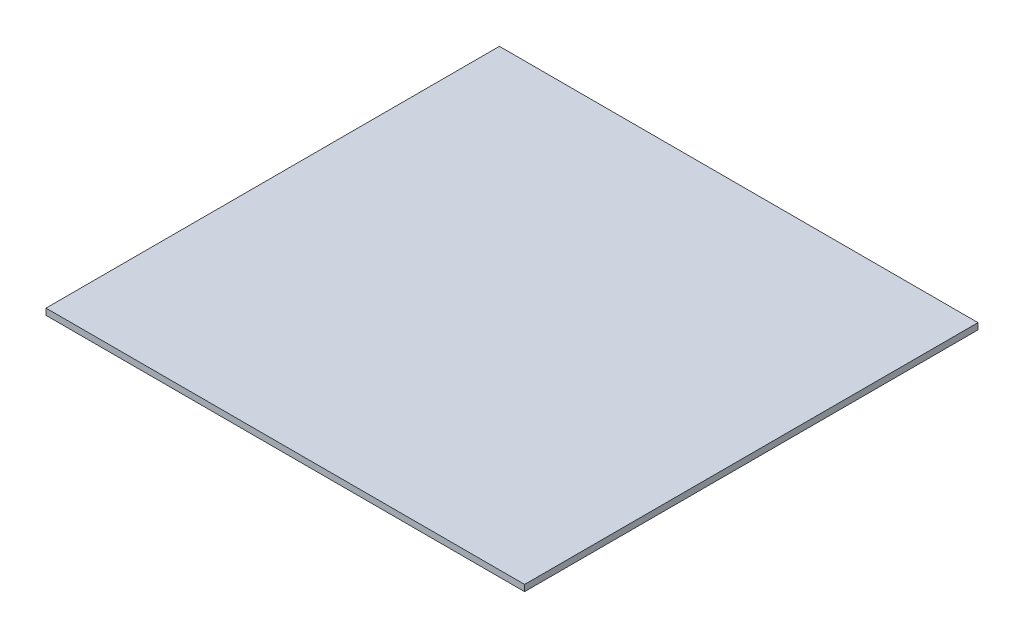
ISO-10303-21;
HEADER;
FILE_DESCRIPTION(('STEP AP214'),'2;1');
FILE_NAME('part.step','',(''),(''),'','','');
FILE_SCHEMA(('AUTOMOTIVE_DESIGN { 1 0 10303 214 1 1 1 1 }'));
ENDSEC;
DATA;
#1=APPLICATION_CONTEXT('core data for automotive mechanical design processes');
#2=APPLICATION_PROTOCOL_DEFINITION('international standard','automotive_design',2000,#1);
#3=PRODUCT_CONTEXT('',#1,'mechanical');
#4=PRODUCT('Part','Part','',(#3));
#5=PRODUCT_RELATED_PRODUCT_CATEGORY('part','',(#4));
#6=PRODUCT_DEFINITION_FORMATION('','',#4);
#7=PRODUCT_DEFINITION_CONTEXT('part definition',#1,'design');
#8=PRODUCT_DEFINITION('design','',#6,#7);
#9=PRODUCT_DEFINITION_SHAPE('','',#8);
#10=(LENGTH_UNIT() NAMED_UNIT(*) SI_UNIT(.MILLI.,.METRE.));
#11=(NAMED_UNIT(*) PLANE_ANGLE_UNIT() SI_UNIT($,.RADIAN.));
#12=(NAMED_UNIT(*) SI_UNIT($,.STERADIAN.) SOLID_ANGLE_UNIT());
#13=UNCERTAINTY_MEASURE_WITH_UNIT(LENGTH_MEASURE(1.E-05),#10,'distance_accuracy_value','');
#14=(GEOMETRIC_REPRESENTATION_CONTEXT(3) GLOBAL_UNCERTAINTY_ASSIGNED_CONTEXT((#13)) GLOBAL_UNIT_ASSIGNED_CONTEXT((#10,
#11,#12)) REPRESENTATION_CONTEXT('',''));
#15=CARTESIAN_POINT('',(0.,0.,0.));
#16=DIRECTION('',(0.,0.,1.));
#17=DIRECTION('',(1.,0.,0.));
#18=AXIS2_PLACEMENT_3D('',#15,#16,#17);
#19=CARTESIAN_POINT('',(0.,12.7,0.));
#20=DIRECTION('',(1.,0.,0.));
#21=DIRECTION('',(0.,0.,-1.));
#22=AXIS2_PLACEMENT_3D('',#19,#20,#21);
#23=PLANE('',#22);
#24=DIRECTION('',(0.,0.,1.));
#25=VECTOR('',#24,1.);
#26=CARTESIAN_POINT('',(0.,0.,0.));
#27=LINE('',#26,#25);
#28=CARTESIAN_POINT('',(0.,0.,-914.4));
#29=VERTEX_POINT('',#28);
#30=CARTESIAN_POINT('',(0.,0.,0.));
#31=VERTEX_POINT('',#30);
#32=EDGE_CURVE('E99',#29,#31,#27,.T.);
#33=ORIENTED_EDGE('',*,*,#32,.T.);
#34=DIRECTION('',(0.,-1.,0.));
#35=VECTOR('',#34,1.);
#36=CARTESIAN_POINT('',(0.,12.7,0.));
#37=LINE('',#36,#35);
#38=CARTESIAN_POINT('',(0.,12.7,0.));
#39=VERTEX_POINT('',#38);
#40=EDGE_CURVE('E11',#39,#31,#37,.T.);
#41=ORIENTED_EDGE('',*,*,#40,.F.);
#42=DIRECTION('',(0.,0.,1.));
#43=VECTOR('',#42,1.);
#44=CARTESIAN_POINT('',(0.,12.7,0.));
#45=LINE('',#44,#43);
#46=CARTESIAN_POINT('',(0.,12.7,-914.4));
#47=VERTEX_POINT('',#46);
#48=EDGE_CURVE('E87',#47,#39,#45,.T.);
#49=ORIENTED_EDGE('',*,*,#48,.F.);
#50=DIRECTION('',(0.,-1.,0.));
#51=VECTOR('',#50,1.);
#52=CARTESIAN_POINT('',(0.,12.7,-914.4));
#53=LINE('',#52,#51);
#54=EDGE_CURVE('E95',#47,#29,#53,.T.);
#55=ORIENTED_EDGE('',*,*,#54,.T.);
#56=EDGE_LOOP('',(#33,#41,#49,#55));
#57=FACE_BOUND('',#56,.T.);
#58=ADVANCED_FACE('F36',(#57),#23,.F.);
#59=CARTESIAN_POINT('',(0.,12.7,0.));
#60=DIRECTION('',(0.,0.,-1.));
#61=DIRECTION('',(-1.,0.,0.));
#62=AXIS2_PLACEMENT_3D('',#59,#60,#61);
#63=PLANE('',#62);
#64=DIRECTION('',(1.,0.,0.));
#65=VECTOR('',#64,1.);
#66=CARTESIAN_POINT('',(0.,0.,0.));
#67=LINE('',#66,#65);
#68=CARTESIAN_POINT('',(965.2,0.,0.));
#69=VERTEX_POINT('',#68);
#70=EDGE_CURVE('E91',#31,#69,#67,.T.);
#71=ORIENTED_EDGE('',*,*,#70,.T.);
#72=DIRECTION('',(0.,-1.,0.));
#73=VECTOR('',#72,1.);
#74=CARTESIAN_POINT('',(965.2,12.7,0.));
#75=LINE('',#74,#73);
#76=CARTESIAN_POINT('',(965.2,12.7,0.));
#77=VERTEX_POINT('',#76);
#78=EDGE_CURVE('E44',#77,#69,#75,.T.);
#79=ORIENTED_EDGE('',*,*,#78,.F.);
#80=DIRECTION('',(1.,0.,0.));
#81=VECTOR('',#80,1.);
#82=CARTESIAN_POINT('',(0.,12.7,0.));
#83=LINE('',#82,#81);
#84=EDGE_CURVE('E82',#39,#77,#83,.T.);
#85=ORIENTED_EDGE('',*,*,#84,.F.);
#86=ORIENTED_EDGE('',*,*,#40,.T.);
#87=EDGE_LOOP('',(#71,#79,#85,#86));
#88=FACE_BOUND('',#87,.T.);
#89=ADVANCED_FACE('F90',(#88),#63,.F.);
#90=CARTESIAN_POINT('',(965.2,12.7,0.));
#91=DIRECTION('',(-1.,0.,0.));
#92=DIRECTION('',(0.,0.,1.));
#93=AXIS2_PLACEMENT_3D('',#90,#91,#92);
#94=PLANE('',#93);
#95=DIRECTION('',(0.,0.,-1.));
#96=VECTOR('',#95,1.);
#97=CARTESIAN_POINT('',(965.2,0.,0.));
#98=LINE('',#97,#96);
#99=CARTESIAN_POINT('',(965.2,0.,-914.4));
#100=VERTEX_POINT('',#99);
#101=EDGE_CURVE('E69',#69,#100,#98,.T.);
#102=ORIENTED_EDGE('',*,*,#101,.T.);
#103=DIRECTION('',(0.,-1.,0.));
#104=VECTOR('',#103,1.);
#105=CARTESIAN_POINT('',(965.2,12.7,-914.4));
#106=LINE('',#105,#104);
#107=CARTESIAN_POINT('',(965.2,12.7,-914.4));
#108=VERTEX_POINT('',#107);
#109=EDGE_CURVE('E92',#108,#100,#106,.T.);
#110=ORIENTED_EDGE('',*,*,#109,.F.);
#111=DIRECTION('',(0.,0.,-1.));
#112=VECTOR('',#111,1.);
#113=CARTESIAN_POINT('',(965.2,12.7,0.));
#114=LINE('',#113,#112);
#115=EDGE_CURVE('E85',#77,#108,#114,.T.);
#116=ORIENTED_EDGE('',*,*,#115,.F.);
#117=ORIENTED_EDGE('',*,*,#78,.T.);
#118=EDGE_LOOP('',(#102,#110,#116,#117));
#119=FACE_BOUND('',#118,.T.);
#120=ADVANCED_FACE('F93',(#119),#94,.F.);
#121=CARTESIAN_POINT('',(0.,12.7,-914.4));
#122=DIRECTION('',(0.,0.,1.));
#123=DIRECTION('',(1.,0.,0.));
#124=AXIS2_PLACEMENT_3D('',#121,#122,#123);
#125=PLANE('',#124);
#126=DIRECTION('',(-1.,0.,0.));
#127=VECTOR('',#126,1.);
#128=CARTESIAN_POINT('',(0.,0.,-914.4));
#129=LINE('',#128,#127);
#130=EDGE_CURVE('E75',#100,#29,#129,.T.);
#131=ORIENTED_EDGE('',*,*,#130,.T.);
#132=ORIENTED_EDGE('',*,*,#54,.F.);
#133=DIRECTION('',(-1.,0.,0.));
#134=VECTOR('',#133,1.);
#135=CARTESIAN_POINT('',(0.,12.7,-914.4));
#136=LINE('',#135,#134);
#137=EDGE_CURVE('E52',#108,#47,#136,.T.);
#138=ORIENTED_EDGE('',*,*,#137,.F.);
#139=ORIENTED_EDGE('',*,*,#109,.T.);
#140=EDGE_LOOP('',(#131,#132,#138,#139));
#141=FACE_BOUND('',#140,.T.);
#142=ADVANCED_FACE('F106',(#141),#125,.F.);
#143=CARTESIAN_POINT('',(0.,12.7,0.));
#144=DIRECTION('',(0.,-1.,0.));
#145=DIRECTION('',(0.,0.,-1.));
#146=AXIS2_PLACEMENT_3D('',#143,#144,#145);
#147=PLANE('',#146);
#148=ORIENTED_EDGE('',*,*,#48,.T.);
#149=ORIENTED_EDGE('',*,*,#84,.T.);
#150=ORIENTED_EDGE('',*,*,#115,.T.);
#151=ORIENTED_EDGE('',*,*,#137,.T.);
#152=EDGE_LOOP('',(#148,#149,#150,#151));
#153=FACE_BOUND('',#152,.T.);
#154=ADVANCED_FACE('F83',(#153),#147,.F.);
#155=CARTESIAN_POINT('',(0.,0.,0.));
#156=DIRECTION('',(0.,-1.,0.));
#157=DIRECTION('',(0.,0.,-1.));
#158=AXIS2_PLACEMENT_3D('',#155,#156,#157);
#159=PLANE('',#158);
#160=ORIENTED_EDGE('',*,*,#32,.F.);
#161=ORIENTED_EDGE('',*,*,#130,.F.);
#162=ORIENTED_EDGE('',*,*,#101,.F.);
#163=ORIENTED_EDGE('',*,*,#70,.F.);
#164=EDGE_LOOP('',(#160,#161,#162,#163));
#165=FACE_BOUND('',#164,.T.);
#166=ADVANCED_FACE('F109',(#165),#159,.T.);
#167=CLOSED_SHELL('',(#58,#89,#120,#142,#154,#166));
#168=MANIFOLD_SOLID_BREP('B2',#167);
#169=ADVANCED_BREP_SHAPE_REPRESENTATION('',(#18,#168),#14);
#170=SHAPE_DEFINITION_REPRESENTATION(#9,#169);
ENDSEC;
END-ISO-10303-21;
